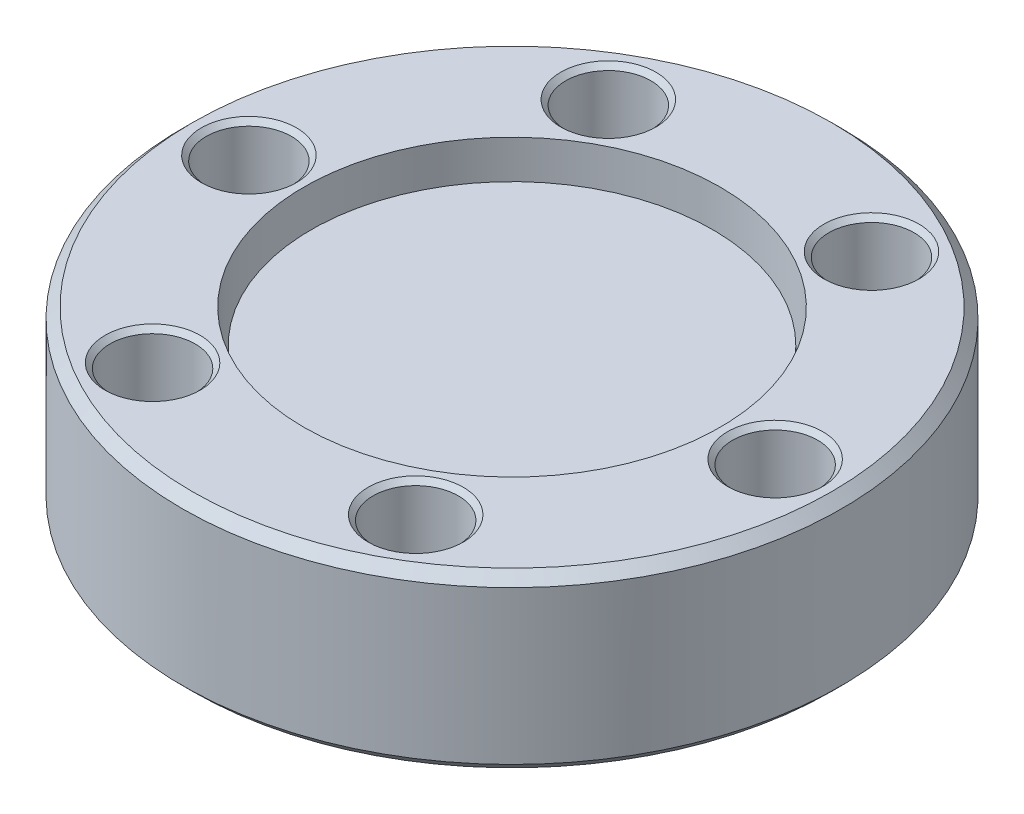
ISO-10303-21;
HEADER;
FILE_DESCRIPTION(('STEP AP214'),'2;1');
FILE_NAME('part.step','',(''),(''),'','','');
FILE_SCHEMA(('AUTOMOTIVE_DESIGN { 1 0 10303 214 1 1 1 1 }'));
ENDSEC;
DATA;
#1=APPLICATION_CONTEXT('core data for automotive mechanical design processes');
#2=APPLICATION_PROTOCOL_DEFINITION('international standard','automotive_design',2000,#1);
#3=PRODUCT_CONTEXT('',#1,'mechanical');
#4=PRODUCT('Part','Part','',(#3));
#5=PRODUCT_RELATED_PRODUCT_CATEGORY('part','',(#4));
#6=PRODUCT_DEFINITION_FORMATION('','',#4);
#7=PRODUCT_DEFINITION_CONTEXT('part definition',#1,'design');
#8=PRODUCT_DEFINITION('design','',#6,#7);
#9=PRODUCT_DEFINITION_SHAPE('','',#8);
#10=(LENGTH_UNIT() NAMED_UNIT(*) SI_UNIT(.MILLI.,.METRE.));
#11=(NAMED_UNIT(*) PLANE_ANGLE_UNIT() SI_UNIT($,.RADIAN.));
#12=(NAMED_UNIT(*) SI_UNIT($,.STERADIAN.) SOLID_ANGLE_UNIT());
#13=UNCERTAINTY_MEASURE_WITH_UNIT(LENGTH_MEASURE(1.E-05),#10,'distance_accuracy_value','');
#14=(GEOMETRIC_REPRESENTATION_CONTEXT(3) GLOBAL_UNCERTAINTY_ASSIGNED_CONTEXT((#13)) GLOBAL_UNIT_ASSIGNED_CONTEXT((#10,
#11,#12)) REPRESENTATION_CONTEXT('',''));
#15=CARTESIAN_POINT('',(0.,0.,0.));
#16=DIRECTION('',(0.,0.,1.));
#17=DIRECTION('',(1.,0.,0.));
#18=AXIS2_PLACEMENT_3D('',#15,#16,#17);
#19=CARTESIAN_POINT('',(0.,0.,0.));
#20=DIRECTION('',(0.,1.,0.));
#21=DIRECTION('',(0.,0.,1.));
#22=AXIS2_PLACEMENT_3D('',#19,#20,#21);
#23=CONICAL_SURFACE('',#22,16.383,0.785398163397452);
#24=CARTESIAN_POINT('',(0.,0.,0.));
#25=DIRECTION('',(0.,-1.,0.));
#26=DIRECTION('',(0.,0.,-1.));
#27=AXIS2_PLACEMENT_3D('',#24,#25,#26);
#28=CIRCLE('',#27,16.383);
#29=CARTESIAN_POINT('',(0.,0.,-16.383));
#30=VERTEX_POINT('',#29);
#31=EDGE_CURVE('E287',#30,#30,#28,.T.);
#32=ORIENTED_EDGE('',*,*,#31,.F.);
#33=EDGE_LOOP('',(#32));
#34=FACE_BOUND('',#33,.T.);
#35=CARTESIAN_POINT('',(0.,0.508,0.));
#36=DIRECTION('',(0.,1.,0.));
#37=DIRECTION('',(0.,0.,-1.));
#38=AXIS2_PLACEMENT_3D('',#35,#36,#37);
#39=CIRCLE('',#38,16.891);
#40=CARTESIAN_POINT('',(0.,0.508,-16.891));
#41=VERTEX_POINT('',#40);
#42=EDGE_CURVE('E277',#41,#41,#39,.T.);
#43=ORIENTED_EDGE('',*,*,#42,.F.);
#44=EDGE_LOOP('',(#43));
#45=FACE_BOUND('',#44,.T.);
#46=ADVANCED_FACE('F16',(#34,#45),#23,.T.);
#47=CARTESIAN_POINT('',(0.,8.3566,0.));
#48=DIRECTION('',(0.,-1.,0.));
#49=DIRECTION('',(0.,0.,-1.));
#50=AXIS2_PLACEMENT_3D('',#47,#48,#49);
#51=CONICAL_SURFACE('',#50,16.891,0.785398163397452);
#52=CARTESIAN_POINT('',(0.,8.8646,0.));
#53=DIRECTION('',(0.,1.,0.));
#54=DIRECTION('',(0.,0.,1.));
#55=AXIS2_PLACEMENT_3D('',#52,#53,#54);
#56=CIRCLE('',#55,16.383);
#57=CARTESIAN_POINT('',(0.,8.8646,16.383));
#58=VERTEX_POINT('',#57);
#59=EDGE_CURVE('E335',#58,#58,#56,.T.);
#60=ORIENTED_EDGE('',*,*,#59,.F.);
#61=EDGE_LOOP('',(#60));
#62=FACE_BOUND('',#61,.T.);
#63=CARTESIAN_POINT('',(0.,8.3566,0.));
#64=DIRECTION('',(0.,-1.,0.));
#65=DIRECTION('',(0.,0.,1.));
#66=AXIS2_PLACEMENT_3D('',#63,#64,#65);
#67=CIRCLE('',#66,16.891);
#68=CARTESIAN_POINT('',(0.,8.3566,16.891));
#69=VERTEX_POINT('',#68);
#70=EDGE_CURVE('E273',#69,#69,#67,.T.);
#71=ORIENTED_EDGE('',*,*,#70,.F.);
#72=EDGE_LOOP('',(#71));
#73=FACE_BOUND('',#72,.T.);
#74=ADVANCED_FACE('F431',(#62,#73),#51,.T.);
#75=CARTESIAN_POINT('',(6.74370000000013,8.6106,11.6804310310022));
#76=DIRECTION('',(0.,1.,0.));
#77=DIRECTION('',(0.,0.,1.));
#78=AXIS2_PLACEMENT_3D('',#75,#76,#77);
#79=CONICAL_SURFACE('',#78,2.1844,0.785398163397448);
#80=CARTESIAN_POINT('',(6.74370000000013,8.6106,11.6804310310022));
#81=DIRECTION('',(0.,1.,0.));
#82=DIRECTION('',(0.,0.,1.));
#83=AXIS2_PLACEMENT_3D('',#80,#81,#82);
#84=CIRCLE('',#83,2.1844);
#85=CARTESIAN_POINT('',(6.74370000000013,8.6106,13.8648310310022));
#86=VERTEX_POINT('',#85);
#87=EDGE_CURVE('E19',#86,#86,#84,.T.);
#88=ORIENTED_EDGE('',*,*,#87,.F.);
#89=EDGE_LOOP('',(#88));
#90=FACE_BOUND('',#89,.T.);
#91=CARTESIAN_POINT('',(6.74370000000013,8.8646,11.6804310310022));
#92=DIRECTION('',(0.,-1.,0.));
#93=DIRECTION('',(0.,0.,1.));
#94=AXIS2_PLACEMENT_3D('',#91,#92,#93);
#95=CIRCLE('',#94,2.4384);
#96=CARTESIAN_POINT('',(6.74370000000013,8.8646,14.1188310310021));
#97=VERTEX_POINT('',#96);
#98=EDGE_CURVE('E332',#97,#97,#95,.T.);
#99=ORIENTED_EDGE('',*,*,#98,.F.);
#100=EDGE_LOOP('',(#99));
#101=FACE_BOUND('',#100,.T.);
#102=ADVANCED_FACE('F436',(#90,#101),#79,.F.);
#103=CARTESIAN_POINT('',(6.74370000000013,0.,11.6804310310022));
#104=DIRECTION('',(0.,-1.,0.));
#105=DIRECTION('',(0.,0.,-1.));
#106=AXIS2_PLACEMENT_3D('',#103,#104,#105);
#107=CONICAL_SURFACE('',#106,2.4384,0.785398163397448);
#108=CARTESIAN_POINT('',(6.74370000000013,0.25399999999998,11.6804310310022));
#109=DIRECTION('',(0.,-1.,0.));
#110=DIRECTION('',(0.,0.,-1.));
#111=AXIS2_PLACEMENT_3D('',#108,#109,#110);
#112=CIRCLE('',#111,2.1844);
#113=CARTESIAN_POINT('',(6.74370000000013,0.25399999999998,9.49603103100216));
#114=VERTEX_POINT('',#113);
#115=EDGE_CURVE('E10',#114,#114,#112,.T.);
#116=ORIENTED_EDGE('',*,*,#115,.F.);
#117=EDGE_LOOP('',(#116));
#118=FACE_BOUND('',#117,.T.);
#119=CARTESIAN_POINT('',(6.74370000000013,0.,11.6804310310022));
#120=DIRECTION('',(0.,1.,0.));
#121=DIRECTION('',(0.,0.,-1.));
#122=AXIS2_PLACEMENT_3D('',#119,#120,#121);
#123=CIRCLE('',#122,2.4384);
#124=CARTESIAN_POINT('',(6.74370000000013,0.,9.24203103100219));
#125=VERTEX_POINT('',#124);
#126=EDGE_CURVE('E284',#125,#125,#123,.T.);
#127=ORIENTED_EDGE('',*,*,#126,.F.);
#128=EDGE_LOOP('',(#127));
#129=FACE_BOUND('',#128,.T.);
#130=ADVANCED_FACE('F854',(#118,#129),#107,.F.);
#131=CARTESIAN_POINT('',(-6.7436999999999,8.6106,11.6804310310023));
#132=DIRECTION('',(0.,1.,0.));
#133=DIRECTION('',(0.,0.,1.));
#134=AXIS2_PLACEMENT_3D('',#131,#132,#133);
#135=CONICAL_SURFACE('',#134,2.1844,0.785398163397457);
#136=CARTESIAN_POINT('',(-6.7436999999999,8.6106,11.6804310310023));
#137=DIRECTION('',(0.,1.,0.));
#138=DIRECTION('',(0.,0.,1.));
#139=AXIS2_PLACEMENT_3D('',#136,#137,#138);
#140=CIRCLE('',#139,2.1844);
#141=CARTESIAN_POINT('',(-6.7436999999999,8.6106,13.8648310310023));
#142=VERTEX_POINT('',#141);
#143=EDGE_CURVE('E258',#142,#142,#140,.T.);
#144=ORIENTED_EDGE('',*,*,#143,.F.);
#145=EDGE_LOOP('',(#144));
#146=FACE_BOUND('',#145,.T.);
#147=CARTESIAN_POINT('',(-6.7436999999999,8.8646,11.6804310310023));
#148=DIRECTION('',(0.,-1.,0.));
#149=DIRECTION('',(0.,0.,1.));
#150=AXIS2_PLACEMENT_3D('',#147,#148,#149);
#151=CIRCLE('',#150,2.4384);
#152=CARTESIAN_POINT('',(-6.7436999999999,8.8646,14.1188310310023));
#153=VERTEX_POINT('',#152);
#154=EDGE_CURVE('E329',#153,#153,#151,.T.);
#155=ORIENTED_EDGE('',*,*,#154,.F.);
#156=EDGE_LOOP('',(#155));
#157=FACE_BOUND('',#156,.T.);
#158=ADVANCED_FACE('F845',(#146,#157),#135,.F.);
#159=CARTESIAN_POINT('',(-6.7436999999999,0.,11.6804310310023));
#160=DIRECTION('',(0.,-1.,0.));
#161=DIRECTION('',(0.,0.,-1.));
#162=AXIS2_PLACEMENT_3D('',#159,#160,#161);
#163=CONICAL_SURFACE('',#162,2.4384,0.785398163397456);
#164=CARTESIAN_POINT('',(-6.7436999999999,0.253999999999994,11.6804310310023));
#165=DIRECTION('',(0.,-1.,0.));
#166=DIRECTION('',(0.,0.,-1.));
#167=AXIS2_PLACEMENT_3D('',#164,#165,#166);
#168=CIRCLE('',#167,2.1844);
#169=CARTESIAN_POINT('',(-6.7436999999999,0.253999999999994,9.49603103100229));
#170=VERTEX_POINT('',#169);
#171=EDGE_CURVE('E261',#170,#170,#168,.T.);
#172=ORIENTED_EDGE('',*,*,#171,.F.);
#173=EDGE_LOOP('',(#172));
#174=FACE_BOUND('',#173,.T.);
#175=CARTESIAN_POINT('',(-6.7436999999999,0.,11.6804310310023));
#176=DIRECTION('',(0.,1.,0.));
#177=DIRECTION('',(0.,0.,-1.));
#178=AXIS2_PLACEMENT_3D('',#175,#176,#177);
#179=CIRCLE('',#178,2.4384);
#180=CARTESIAN_POINT('',(-6.7436999999999,0.,9.24203103100229));
#181=VERTEX_POINT('',#180);
#182=EDGE_CURVE('E249',#181,#181,#179,.T.);
#183=ORIENTED_EDGE('',*,*,#182,.F.);
#184=EDGE_LOOP('',(#183));
#185=FACE_BOUND('',#184,.T.);
#186=ADVANCED_FACE('F836',(#174,#185),#163,.F.);
#187=CARTESIAN_POINT('',(-13.4874,8.6106,0.));
#188=DIRECTION('',(0.,1.,0.));
#189=DIRECTION('',(0.,0.,1.));
#190=AXIS2_PLACEMENT_3D('',#187,#188,#189);
#191=CONICAL_SURFACE('',#190,2.1844,0.785398163397447);
#192=CARTESIAN_POINT('',(-13.4874,8.6106,0.));
#193=DIRECTION('',(0.,1.,0.));
#194=DIRECTION('',(0.,0.,1.));
#195=AXIS2_PLACEMENT_3D('',#192,#193,#194);
#196=CIRCLE('',#195,2.1844);
#197=CARTESIAN_POINT('',(-13.4874,8.6106,2.1844000000001));
#198=VERTEX_POINT('',#197);
#199=EDGE_CURVE('E361',#198,#198,#196,.T.);
#200=ORIENTED_EDGE('',*,*,#199,.F.);
#201=EDGE_LOOP('',(#200));
#202=FACE_BOUND('',#201,.T.);
#203=CARTESIAN_POINT('',(-13.4874,8.8646,0.));
#204=DIRECTION('',(0.,-1.,0.));
#205=DIRECTION('',(0.,0.,1.));
#206=AXIS2_PLACEMENT_3D('',#203,#204,#205);
#207=CIRCLE('',#206,2.4384);
#208=CARTESIAN_POINT('',(-13.4874,8.8646,2.43840000000009));
#209=VERTEX_POINT('',#208);
#210=EDGE_CURVE('E326',#209,#209,#207,.T.);
#211=ORIENTED_EDGE('',*,*,#210,.F.);
#212=EDGE_LOOP('',(#211));
#213=FACE_BOUND('',#212,.T.);
#214=ADVANCED_FACE('F392',(#202,#213),#191,.F.);
#215=CARTESIAN_POINT('',(-13.4874,0.,0.));
#216=DIRECTION('',(0.,-1.,0.));
#217=DIRECTION('',(0.,0.,-1.));
#218=AXIS2_PLACEMENT_3D('',#215,#216,#217);
#219=CONICAL_SURFACE('',#218,2.4384,0.785398163397436);
#220=CARTESIAN_POINT('',(-13.4874,0.254000000000007,0.));
#221=DIRECTION('',(0.,-1.,0.));
#222=DIRECTION('',(0.,0.,-1.));
#223=AXIS2_PLACEMENT_3D('',#220,#221,#222);
#224=CIRCLE('',#223,2.1844);
#225=CARTESIAN_POINT('',(-13.4874,0.254000000000007,-2.18439999999991));
#226=VERTEX_POINT('',#225);
#227=EDGE_CURVE('E262',#226,#226,#224,.T.);
#228=ORIENTED_EDGE('',*,*,#227,.F.);
#229=EDGE_LOOP('',(#228));
#230=FACE_BOUND('',#229,.T.);
#231=CARTESIAN_POINT('',(-13.4874,0.,0.));
#232=DIRECTION('',(0.,1.,0.));
#233=DIRECTION('',(0.,0.,-1.));
#234=AXIS2_PLACEMENT_3D('',#231,#232,#233);
#235=CIRCLE('',#234,2.4384);
#236=CARTESIAN_POINT('',(-13.4874,0.,-2.43839999999991));
#237=VERTEX_POINT('',#236);
#238=EDGE_CURVE('E272',#237,#237,#235,.T.);
#239=ORIENTED_EDGE('',*,*,#238,.F.);
#240=EDGE_LOOP('',(#239));
#241=FACE_BOUND('',#240,.T.);
#242=ADVANCED_FACE('F388',(#230,#241),#219,.F.);
#243=CARTESIAN_POINT('',(-6.7437,8.6106,-11.6804310310022));
#244=DIRECTION('',(0.,1.,0.));
#245=DIRECTION('',(0.,0.,1.));
#246=AXIS2_PLACEMENT_3D('',#243,#244,#245);
#247=CONICAL_SURFACE('',#246,2.1844,0.785398163397465);
#248=CARTESIAN_POINT('',(-6.7437,8.6106,-11.6804310310022));
#249=DIRECTION('',(0.,1.,0.));
#250=DIRECTION('',(0.,0.,1.));
#251=AXIS2_PLACEMENT_3D('',#248,#249,#250);
#252=CIRCLE('',#251,2.1844);
#253=CARTESIAN_POINT('',(-6.7437,8.6106,-9.49603103100221));
#254=VERTEX_POINT('',#253);
#255=EDGE_CURVE('E362',#254,#254,#252,.T.);
#256=ORIENTED_EDGE('',*,*,#255,.F.);
#257=EDGE_LOOP('',(#256));
#258=FACE_BOUND('',#257,.T.);
#259=CARTESIAN_POINT('',(-6.7437,8.8646,-11.6804310310022));
#260=DIRECTION('',(0.,-1.,0.));
#261=DIRECTION('',(0.,0.,1.));
#262=AXIS2_PLACEMENT_3D('',#259,#260,#261);
#263=CIRCLE('',#262,2.4384);
#264=CARTESIAN_POINT('',(-6.7437,8.8646,-9.24203103100219));
#265=VERTEX_POINT('',#264);
#266=EDGE_CURVE('E323',#265,#265,#263,.T.);
#267=ORIENTED_EDGE('',*,*,#266,.F.);
#268=EDGE_LOOP('',(#267));
#269=FACE_BOUND('',#268,.T.);
#270=ADVANCED_FACE('F391',(#258,#269),#247,.F.);
#271=CARTESIAN_POINT('',(-6.7437,0.,-11.6804310310022));
#272=DIRECTION('',(0.,-1.,0.));
#273=DIRECTION('',(0.,0.,-1.));
#274=AXIS2_PLACEMENT_3D('',#271,#272,#273);
#275=CONICAL_SURFACE('',#274,2.4384,0.785398163397442);
#276=CARTESIAN_POINT('',(-6.7437,0.253999999999994,-11.6804310310022));
#277=DIRECTION('',(0.,-1.,0.));
#278=DIRECTION('',(0.,0.,-1.));
#279=AXIS2_PLACEMENT_3D('',#276,#277,#278);
#280=CIRCLE('',#279,2.1844);
#281=CARTESIAN_POINT('',(-6.7437,0.253999999999994,-13.8648310310022));
#282=VERTEX_POINT('',#281);
#283=EDGE_CURVE('E358',#282,#282,#280,.T.);
#284=ORIENTED_EDGE('',*,*,#283,.F.);
#285=EDGE_LOOP('',(#284));
#286=FACE_BOUND('',#285,.T.);
#287=CARTESIAN_POINT('',(-6.7437,0.,-11.6804310310022));
#288=DIRECTION('',(0.,1.,0.));
#289=DIRECTION('',(0.,0.,-1.));
#290=AXIS2_PLACEMENT_3D('',#287,#288,#289);
#291=CIRCLE('',#290,2.4384);
#292=CARTESIAN_POINT('',(-6.7437,0.,-14.1188310310022));
#293=VERTEX_POINT('',#292);
#294=EDGE_CURVE('E252',#293,#293,#291,.T.);
#295=ORIENTED_EDGE('',*,*,#294,.F.);
#296=EDGE_LOOP('',(#295));
#297=FACE_BOUND('',#296,.T.);
#298=ADVANCED_FACE('F811',(#286,#297),#275,.F.);
#299=CARTESIAN_POINT('',(6.7437,8.6106,-11.6804310310023));
#300=DIRECTION('',(0.,1.,0.));
#301=DIRECTION('',(0.,0.,1.));
#302=AXIS2_PLACEMENT_3D('',#299,#300,#301);
#303=CONICAL_SURFACE('',#302,2.1844,0.785398163397454);
#304=CARTESIAN_POINT('',(6.7437,8.6106,-11.6804310310023));
#305=DIRECTION('',(0.,1.,0.));
#306=DIRECTION('',(0.,0.,1.));
#307=AXIS2_PLACEMENT_3D('',#304,#305,#306);
#308=CIRCLE('',#307,2.1844);
#309=CARTESIAN_POINT('',(6.7437,8.6106,-9.49603103100227));
#310=VERTEX_POINT('',#309);
#311=EDGE_CURVE('E371',#310,#310,#308,.T.);
#312=ORIENTED_EDGE('',*,*,#311,.F.);
#313=EDGE_LOOP('',(#312));
#314=FACE_BOUND('',#313,.T.);
#315=CARTESIAN_POINT('',(6.7437,8.8646,-11.6804310310023));
#316=DIRECTION('',(0.,-1.,0.));
#317=DIRECTION('',(0.,0.,1.));
#318=AXIS2_PLACEMENT_3D('',#315,#316,#317);
#319=CIRCLE('',#318,2.4384);
#320=CARTESIAN_POINT('',(6.7437,8.8646,-9.24203103100224));
#321=VERTEX_POINT('',#320);
#322=EDGE_CURVE('E320',#321,#321,#319,.T.);
#323=ORIENTED_EDGE('',*,*,#322,.F.);
#324=EDGE_LOOP('',(#323));
#325=FACE_BOUND('',#324,.T.);
#326=ADVANCED_FACE('F795',(#314,#325),#303,.F.);
#327=CARTESIAN_POINT('',(6.7437,0.,-11.6804310310023));
#328=DIRECTION('',(0.,-1.,0.));
#329=DIRECTION('',(0.,0.,-1.));
#330=AXIS2_PLACEMENT_3D('',#327,#328,#329);
#331=CONICAL_SURFACE('',#330,2.4384,0.785398163397457);
#332=CARTESIAN_POINT('',(6.7437,0.253999999999988,-11.6804310310023));
#333=DIRECTION('',(0.,-1.,0.));
#334=DIRECTION('',(0.,0.,-1.));
#335=AXIS2_PLACEMENT_3D('',#332,#333,#334);
#336=CIRCLE('',#335,2.1844);
#337=CARTESIAN_POINT('',(6.7437,0.253999999999988,-13.8648310310023));
#338=VERTEX_POINT('',#337);
#339=EDGE_CURVE('E374',#338,#338,#336,.T.);
#340=ORIENTED_EDGE('',*,*,#339,.F.);
#341=EDGE_LOOP('',(#340));
#342=FACE_BOUND('',#341,.T.);
#343=CARTESIAN_POINT('',(6.7437,0.,-11.6804310310023));
#344=DIRECTION('',(0.,1.,0.));
#345=DIRECTION('',(0.,0.,-1.));
#346=AXIS2_PLACEMENT_3D('',#343,#344,#345);
#347=CIRCLE('',#346,2.4384);
#348=CARTESIAN_POINT('',(6.7437,0.,-14.1188310310022));
#349=VERTEX_POINT('',#348);
#350=EDGE_CURVE('E250',#349,#349,#347,.T.);
#351=ORIENTED_EDGE('',*,*,#350,.F.);
#352=EDGE_LOOP('',(#351));
#353=FACE_BOUND('',#352,.T.);
#354=ADVANCED_FACE('F791',(#342,#353),#331,.F.);
#355=CARTESIAN_POINT('',(6.74370000000013,0.,11.6804310310022));
#356=DIRECTION('',(0.,1.,0.));
#357=DIRECTION('',(0.,0.,1.));
#358=AXIS2_PLACEMENT_3D('',#355,#356,#357);
#359=CYLINDRICAL_SURFACE('',#358,2.1844);
#360=ORIENTED_EDGE('',*,*,#115,.T.);
#361=EDGE_LOOP('',(#360));
#362=FACE_BOUND('',#361,.T.);
#363=ORIENTED_EDGE('',*,*,#87,.T.);
#364=EDGE_LOOP('',(#363));
#365=FACE_BOUND('',#364,.T.);
#366=ADVANCED_FACE('F785',(#362,#365),#359,.F.);
#367=CARTESIAN_POINT('',(-6.7436999999999,0.,11.6804310310023));
#368=DIRECTION('',(0.,1.,0.));
#369=DIRECTION('',(0.,0.,1.));
#370=AXIS2_PLACEMENT_3D('',#367,#368,#369);
#371=CYLINDRICAL_SURFACE('',#370,2.1844);
#372=ORIENTED_EDGE('',*,*,#171,.T.);
#373=EDGE_LOOP('',(#372));
#374=FACE_BOUND('',#373,.T.);
#375=ORIENTED_EDGE('',*,*,#143,.T.);
#376=EDGE_LOOP('',(#375));
#377=FACE_BOUND('',#376,.T.);
#378=ADVANCED_FACE('F777',(#374,#377),#371,.F.);
#379=CARTESIAN_POINT('',(-13.4874,0.,0.));
#380=DIRECTION('',(0.,1.,0.));
#381=DIRECTION('',(0.,0.,1.));
#382=AXIS2_PLACEMENT_3D('',#379,#380,#381);
#383=CYLINDRICAL_SURFACE('',#382,2.1844);
#384=ORIENTED_EDGE('',*,*,#227,.T.);
#385=EDGE_LOOP('',(#384));
#386=FACE_BOUND('',#385,.T.);
#387=ORIENTED_EDGE('',*,*,#199,.T.);
#388=EDGE_LOOP('',(#387));
#389=FACE_BOUND('',#388,.T.);
#390=ADVANCED_FACE('F385',(#386,#389),#383,.F.);
#391=CARTESIAN_POINT('',(-6.7437,0.,-11.6804310310022));
#392=DIRECTION('',(0.,1.,0.));
#393=DIRECTION('',(0.,0.,1.));
#394=AXIS2_PLACEMENT_3D('',#391,#392,#393);
#395=CYLINDRICAL_SURFACE('',#394,2.1844);
#396=ORIENTED_EDGE('',*,*,#283,.T.);
#397=EDGE_LOOP('',(#396));
#398=FACE_BOUND('',#397,.T.);
#399=ORIENTED_EDGE('',*,*,#255,.T.);
#400=EDGE_LOOP('',(#399));
#401=FACE_BOUND('',#400,.T.);
#402=ADVANCED_FACE('F761',(#398,#401),#395,.F.);
#403=CARTESIAN_POINT('',(6.7437,0.,-11.6804310310023));
#404=DIRECTION('',(0.,1.,0.));
#405=DIRECTION('',(0.,0.,1.));
#406=AXIS2_PLACEMENT_3D('',#403,#404,#405);
#407=CYLINDRICAL_SURFACE('',#406,2.1844);
#408=ORIENTED_EDGE('',*,*,#339,.T.);
#409=EDGE_LOOP('',(#408));
#410=FACE_BOUND('',#409,.T.);
#411=ORIENTED_EDGE('',*,*,#311,.T.);
#412=EDGE_LOOP('',(#411));
#413=FACE_BOUND('',#412,.T.);
#414=ADVANCED_FACE('F517',(#410,#413),#407,.F.);
#415=CARTESIAN_POINT('',(13.4874,8.6106,0.));
#416=DIRECTION('',(0.,1.,0.));
#417=DIRECTION('',(0.,0.,1.));
#418=AXIS2_PLACEMENT_3D('',#415,#416,#417);
#419=CONICAL_SURFACE('',#418,2.1844,0.785398163397447);
#420=CARTESIAN_POINT('',(13.4874,8.6106,0.));
#421=DIRECTION('',(0.,1.,0.));
#422=DIRECTION('',(0.,0.,1.));
#423=AXIS2_PLACEMENT_3D('',#420,#421,#422);
#424=CIRCLE('',#423,2.1844);
#425=CARTESIAN_POINT('',(13.4874,8.6106,2.1844));
#426=VERTEX_POINT('',#425);
#427=EDGE_CURVE('E365',#426,#426,#424,.T.);
#428=ORIENTED_EDGE('',*,*,#427,.F.);
#429=EDGE_LOOP('',(#428));
#430=FACE_BOUND('',#429,.T.);
#431=CARTESIAN_POINT('',(13.4874,8.8646,0.));
#432=DIRECTION('',(0.,-1.,0.));
#433=DIRECTION('',(0.,0.,1.));
#434=AXIS2_PLACEMENT_3D('',#431,#432,#433);
#435=CIRCLE('',#434,2.4384);
#436=CARTESIAN_POINT('',(13.4874,8.8646,2.4384));
#437=VERTEX_POINT('',#436);
#438=EDGE_CURVE('E317',#437,#437,#435,.T.);
#439=ORIENTED_EDGE('',*,*,#438,.F.);
#440=EDGE_LOOP('',(#439));
#441=FACE_BOUND('',#440,.T.);
#442=ADVANCED_FACE('F514',(#430,#441),#419,.F.);
#443=CARTESIAN_POINT('',(13.4874,0.,0.));
#444=DIRECTION('',(0.,-1.,0.));
#445=DIRECTION('',(0.,0.,-1.));
#446=AXIS2_PLACEMENT_3D('',#443,#444,#445);
#447=CONICAL_SURFACE('',#446,2.4384,0.785398163397436);
#448=CARTESIAN_POINT('',(13.4874,0.254000000000007,0.));
#449=DIRECTION('',(0.,-1.,0.));
#450=DIRECTION('',(0.,0.,-1.));
#451=AXIS2_PLACEMENT_3D('',#448,#449,#450);
#452=CIRCLE('',#451,2.1844);
#453=CARTESIAN_POINT('',(13.4874,0.254000000000007,-2.1844));
#454=VERTEX_POINT('',#453);
#455=EDGE_CURVE('E368',#454,#454,#452,.T.);
#456=ORIENTED_EDGE('',*,*,#455,.F.);
#457=EDGE_LOOP('',(#456));
#458=FACE_BOUND('',#457,.T.);
#459=CARTESIAN_POINT('',(13.4874,0.,0.));
#460=DIRECTION('',(0.,1.,0.));
#461=DIRECTION('',(0.,0.,-1.));
#462=AXIS2_PLACEMENT_3D('',#459,#460,#461);
#463=CIRCLE('',#462,2.4384);
#464=CARTESIAN_POINT('',(13.4874,0.,-2.4384));
#465=VERTEX_POINT('',#464);
#466=EDGE_CURVE('E245',#465,#465,#463,.T.);
#467=ORIENTED_EDGE('',*,*,#466,.F.);
#468=EDGE_LOOP('',(#467));
#469=FACE_BOUND('',#468,.T.);
#470=ADVANCED_FACE('F425',(#458,#469),#447,.F.);
#471=CARTESIAN_POINT('',(13.4874,0.,0.));
#472=DIRECTION('',(0.,1.,0.));
#473=DIRECTION('',(0.,0.,1.));
#474=AXIS2_PLACEMENT_3D('',#471,#472,#473);
#475=CYLINDRICAL_SURFACE('',#474,2.1844);
#476=ORIENTED_EDGE('',*,*,#455,.T.);
#477=EDGE_LOOP('',(#476));
#478=FACE_BOUND('',#477,.T.);
#479=ORIENTED_EDGE('',*,*,#427,.T.);
#480=EDGE_LOOP('',(#479));
#481=FACE_BOUND('',#480,.T.);
#482=ADVANCED_FACE('F414',(#478,#481),#475,.F.);
#483=CARTESIAN_POINT('',(0.,0.,0.));
#484=DIRECTION('',(0.,-1.,0.));
#485=DIRECTION('',(0.,0.,-1.));
#486=AXIS2_PLACEMENT_3D('',#483,#484,#485);
#487=CYLINDRICAL_SURFACE('',#486,10.7188);
#488=CARTESIAN_POINT('',(0.,1.20818032492242,0.));
#489=DIRECTION('',(0.,-1.,0.));
#490=DIRECTION('',(0.,0.,-1.));
#491=AXIS2_PLACEMENT_3D('',#488,#489,#490);
#492=CIRCLE('',#491,10.7188);
#493=CARTESIAN_POINT('',(0.,1.20818032492242,-10.7188));
#494=VERTEX_POINT('',#493);
#495=EDGE_CURVE('E295',#494,#494,#492,.T.);
#496=ORIENTED_EDGE('',*,*,#495,.F.);
#497=EDGE_LOOP('',(#496));
#498=FACE_BOUND('',#497,.T.);
#499=CARTESIAN_POINT('',(0.,0.,0.));
#500=DIRECTION('',(0.,-1.,0.));
#501=DIRECTION('',(0.,0.,-1.));
#502=AXIS2_PLACEMENT_3D('',#499,#500,#501);
#503=CIRCLE('',#502,10.7188);
#504=CARTESIAN_POINT('',(0.,0.,-10.7188));
#505=VERTEX_POINT('',#504);
#506=EDGE_CURVE('E239',#505,#505,#503,.T.);
#507=ORIENTED_EDGE('',*,*,#506,.T.);
#508=EDGE_LOOP('',(#507));
#509=FACE_BOUND('',#508,.T.);
#510=ADVANCED_FACE('F411',(#498,#509),#487,.F.);
#511=CARTESIAN_POINT('',(0.,0.635,0.));
#512=DIRECTION('',(0.,1.,0.));
#513=DIRECTION('',(0.,0.,1.));
#514=AXIS2_PLACEMENT_3D('',#511,#512,#513);
#515=CONICAL_SURFACE('',#514,9.144,1.22173047639603);
#516=CARTESIAN_POINT('',(0.,0.635,0.));
#517=DIRECTION('',(0.,-1.,0.));
#518=DIRECTION('',(0.,0.,-1.));
#519=AXIS2_PLACEMENT_3D('',#516,#517,#518);
#520=CIRCLE('',#519,9.144);
#521=CARTESIAN_POINT('',(0.,0.635,-9.144));
#522=VERTEX_POINT('',#521);
#523=EDGE_CURVE('E292',#522,#522,#520,.T.);
#524=ORIENTED_EDGE('',*,*,#523,.F.);
#525=EDGE_LOOP('',(#524));
#526=FACE_BOUND('',#525,.T.);
#527=ORIENTED_EDGE('',*,*,#495,.T.);
#528=EDGE_LOOP('',(#527));
#529=FACE_BOUND('',#528,.T.);
#530=ADVANCED_FACE('F413',(#526,#529),#515,.T.);
#531=CARTESIAN_POINT('',(0.,0.,0.));
#532=DIRECTION('',(0.,-1.,0.));
#533=DIRECTION('',(0.,0.,-1.));
#534=AXIS2_PLACEMENT_3D('',#531,#532,#533);
#535=CYLINDRICAL_SURFACE('',#534,9.144);
#536=CARTESIAN_POINT('',(0.,1.143,0.));
#537=DIRECTION('',(0.,-1.,0.));
#538=DIRECTION('',(0.,0.,-1.));
#539=AXIS2_PLACEMENT_3D('',#536,#537,#538);
#540=CIRCLE('',#539,9.144);
#541=CARTESIAN_POINT('',(0.,1.143,-9.144));
#542=VERTEX_POINT('',#541);
#543=EDGE_CURVE('E253',#542,#542,#540,.T.);
#544=ORIENTED_EDGE('',*,*,#543,.F.);
#545=EDGE_LOOP('',(#544));
#546=FACE_BOUND('',#545,.T.);
#547=ORIENTED_EDGE('',*,*,#523,.T.);
#548=EDGE_LOOP('',(#547));
#549=FACE_BOUND('',#548,.T.);
#550=ADVANCED_FACE('F422',(#546,#549),#535,.F.);
#551=CARTESIAN_POINT('',(0.,0.,0.));
#552=DIRECTION('',(0.,-1.,0.));
#553=DIRECTION('',(0.,0.,-1.));
#554=AXIS2_PLACEMENT_3D('',#551,#552,#553);
#555=CYLINDRICAL_SURFACE('',#554,8.001);
#556=CARTESIAN_POINT('',(0.,1.651,0.));
#557=DIRECTION('',(0.,-1.,0.));
#558=DIRECTION('',(0.,0.,-1.));
#559=AXIS2_PLACEMENT_3D('',#556,#557,#558);
#560=CIRCLE('',#559,8.001);
#561=CARTESIAN_POINT('',(0.,1.651,-8.001));
#562=VERTEX_POINT('',#561);
#563=EDGE_CURVE('E255',#562,#562,#560,.T.);
#564=ORIENTED_EDGE('',*,*,#563,.F.);
#565=EDGE_LOOP('',(#564));
#566=FACE_BOUND('',#565,.T.);
#567=CARTESIAN_POINT('',(0.,1.143,0.));
#568=DIRECTION('',(0.,-1.,0.));
#569=DIRECTION('',(0.,0.,-1.));
#570=AXIS2_PLACEMENT_3D('',#567,#568,#569);
#571=CIRCLE('',#570,8.001);
#572=CARTESIAN_POINT('',(0.,1.143,-8.001));
#573=VERTEX_POINT('',#572);
#574=EDGE_CURVE('E256',#573,#573,#571,.T.);
#575=ORIENTED_EDGE('',*,*,#574,.T.);
#576=EDGE_LOOP('',(#575));
#577=FACE_BOUND('',#576,.T.);
#578=ADVANCED_FACE('F470',(#566,#577),#555,.F.);
#579=CARTESIAN_POINT('',(0.,0.,0.));
#580=DIRECTION('',(0.,-1.,0.));
#581=DIRECTION('',(0.,0.,-1.));
#582=AXIS2_PLACEMENT_3D('',#579,#580,#581);
#583=CYLINDRICAL_SURFACE('',#582,8.382);
#584=CARTESIAN_POINT('',(0.,2.55438257906458,0.));
#585=DIRECTION('',(0.,-1.,0.));
#586=DIRECTION('',(0.,0.,-1.));
#587=AXIS2_PLACEMENT_3D('',#584,#585,#586);
#588=CIRCLE('',#587,8.382);
#589=CARTESIAN_POINT('',(0.,2.55438257906458,-8.382));
#590=VERTEX_POINT('',#589);
#591=EDGE_CURVE('E296',#590,#590,#588,.T.);
#592=ORIENTED_EDGE('',*,*,#591,.F.);
#593=EDGE_LOOP('',(#592));
#594=FACE_BOUND('',#593,.T.);
#595=CARTESIAN_POINT('',(0.,2.01222733190585,0.));
#596=DIRECTION('',(0.,-1.,0.));
#597=DIRECTION('',(0.,0.,-1.));
#598=AXIS2_PLACEMENT_3D('',#595,#596,#597);
#599=CIRCLE('',#598,8.382);
#600=CARTESIAN_POINT('',(0.,2.01222733190585,-8.382));
#601=VERTEX_POINT('',#600);
#602=EDGE_CURVE('E283',#601,#601,#599,.T.);
#603=ORIENTED_EDGE('',*,*,#602,.T.);
#604=EDGE_LOOP('',(#603));
#605=FACE_BOUND('',#604,.T.);
#606=ADVANCED_FACE('F466',(#594,#605),#583,.F.);
#607=CARTESIAN_POINT('',(0.,2.921,0.));
#608=DIRECTION('',(0.,1.,0.));
#609=DIRECTION('',(0.,0.,1.));
#610=AXIS2_PLACEMENT_3D('',#607,#608,#609);
#611=CONICAL_SURFACE('',#610,9.017,1.0471975511966);
#612=ORIENTED_EDGE('',*,*,#591,.T.);
#613=EDGE_LOOP('',(#612));
#614=FACE_BOUND('',#613,.T.);
#615=CARTESIAN_POINT('',(0.,2.921,0.));
#616=DIRECTION('',(0.,-1.,0.));
#617=DIRECTION('',(0.,0.,-1.));
#618=AXIS2_PLACEMENT_3D('',#615,#616,#617);
#619=CIRCLE('',#618,9.017);
#620=CARTESIAN_POINT('',(0.,2.921,-9.017));
#621=VERTEX_POINT('',#620);
#622=EDGE_CURVE('E276',#621,#621,#619,.T.);
#623=ORIENTED_EDGE('',*,*,#622,.F.);
#624=EDGE_LOOP('',(#623));
#625=FACE_BOUND('',#624,.T.);
#626=ADVANCED_FACE('F462',(#614,#625),#611,.F.);
#627=CARTESIAN_POINT('',(0.,0.,0.));
#628=DIRECTION('',(0.,-1.,0.));
#629=DIRECTION('',(0.,0.,-1.));
#630=AXIS2_PLACEMENT_3D('',#627,#628,#629);
#631=CYLINDRICAL_SURFACE('',#630,9.017);
#632=CARTESIAN_POINT('',(0.,4.064,0.));
#633=DIRECTION('',(0.,-1.,0.));
#634=DIRECTION('',(0.,0.,-1.));
#635=AXIS2_PLACEMENT_3D('',#632,#633,#634);
#636=CIRCLE('',#635,9.017);
#637=CARTESIAN_POINT('',(0.,4.064,-9.017));
#638=VERTEX_POINT('',#637);
#639=EDGE_CURVE('E300',#638,#638,#636,.T.);
#640=ORIENTED_EDGE('',*,*,#639,.F.);
#641=EDGE_LOOP('',(#640));
#642=FACE_BOUND('',#641,.T.);
#643=ORIENTED_EDGE('',*,*,#622,.T.);
#644=EDGE_LOOP('',(#643));
#645=FACE_BOUND('',#644,.T.);
#646=ADVANCED_FACE('F455',(#642,#645),#631,.F.);
#647=CARTESIAN_POINT('',(0.,0.,0.));
#648=DIRECTION('',(0.,-1.,0.));
#649=DIRECTION('',(0.,0.,-1.));
#650=AXIS2_PLACEMENT_3D('',#647,#648,#649);
#651=CYLINDRICAL_SURFACE('',#650,10.668);
#652=CARTESIAN_POINT('',(0.,8.8646,0.));
#653=DIRECTION('',(0.,-1.,0.));
#654=DIRECTION('',(0.,0.,-1.));
#655=AXIS2_PLACEMENT_3D('',#652,#653,#654);
#656=CIRCLE('',#655,10.668);
#657=CARTESIAN_POINT('',(0.,8.8646,-10.668));
#658=VERTEX_POINT('',#657);
#659=EDGE_CURVE('E314',#658,#658,#656,.T.);
#660=ORIENTED_EDGE('',*,*,#659,.F.);
#661=EDGE_LOOP('',(#660));
#662=FACE_BOUND('',#661,.T.);
#663=CARTESIAN_POINT('',(0.,4.064,0.));
#664=DIRECTION('',(0.,-1.,0.));
#665=DIRECTION('',(0.,0.,-1.));
#666=AXIS2_PLACEMENT_3D('',#663,#664,#665);
#667=CIRCLE('',#666,10.668);
#668=CARTESIAN_POINT('',(0.,4.064,-10.668));
#669=VERTEX_POINT('',#668);
#670=EDGE_CURVE('E297',#669,#669,#667,.T.);
#671=ORIENTED_EDGE('',*,*,#670,.T.);
#672=EDGE_LOOP('',(#671));
#673=FACE_BOUND('',#672,.T.);
#674=ADVANCED_FACE('F445',(#662,#673),#651,.F.);
#675=CARTESIAN_POINT('',(0.,0.,0.));
#676=DIRECTION('',(0.,-1.,0.));
#677=DIRECTION('',(0.,0.,-1.));
#678=AXIS2_PLACEMENT_3D('',#675,#676,#677);
#679=CYLINDRICAL_SURFACE('',#678,16.891);
#680=ORIENTED_EDGE('',*,*,#70,.T.);
#681=EDGE_LOOP('',(#680));
#682=FACE_BOUND('',#681,.T.);
#683=ORIENTED_EDGE('',*,*,#42,.T.);
#684=EDGE_LOOP('',(#683));
#685=FACE_BOUND('',#684,.T.);
#686=ADVANCED_FACE('F442',(#682,#685),#679,.T.);
#687=CARTESIAN_POINT('',(0.,4.445,0.));
#688=DIRECTION('',(0.,-1.,0.));
#689=DIRECTION('',(-0.00514055764111362,0.,-0.999986787246281));
#690=AXIS2_PLACEMENT_3D('',#687,#688,#689);
#691=TOROIDAL_SURFACE('',#690,10.033,0.254);
#692=CARTESIAN_POINT('',(0.,4.445,0.));
#693=DIRECTION('',(0.,1.,0.));
#694=DIRECTION('',(-0.00514055764111273,0.,-0.999986787246281));
#695=AXIS2_PLACEMENT_3D('',#692,#693,#694);
#696=CIRCLE('',#695,10.287);
#697=CARTESIAN_POINT('',(-0.0528809164541268,4.445,-10.2868640804025));
#698=VERTEX_POINT('',#697);
#699=EDGE_CURVE('E304',#698,#698,#696,.T.);
#700=ORIENTED_EDGE('',*,*,#699,.F.);
#701=EDGE_LOOP('',(#700));
#702=FACE_BOUND('',#701,.T.);
#703=CARTESIAN_POINT('',(0.,4.191,0.));
#704=DIRECTION('',(0.,-1.,0.));
#705=DIRECTION('',(-0.00514055764111362,0.,-0.999986787246281));
#706=AXIS2_PLACEMENT_3D('',#703,#704,#705);
#707=CIRCLE('',#706,10.033);
#708=CARTESIAN_POINT('',(-0.051575214813293,4.191,-10.0328674364419));
#709=VERTEX_POINT('',#708);
#710=EDGE_CURVE('E263',#709,#709,#707,.T.);
#711=ORIENTED_EDGE('',*,*,#710,.F.);
#712=EDGE_LOOP('',(#711));
#713=FACE_BOUND('',#712,.T.);
#714=ADVANCED_FACE('F444',(#702,#713),#691,.T.);
#715=CARTESIAN_POINT('',(0.,4.4958,0.));
#716=DIRECTION('',(0.,1.,0.));
#717=DIRECTION('',(0.00514055764111362,0.,0.999986787246281));
#718=AXIS2_PLACEMENT_3D('',#715,#716,#717);
#719=CONICAL_SURFACE('',#718,8.3947,0.785398163397445);
#720=CARTESIAN_POINT('',(0.,4.1148,0.));
#721=DIRECTION('',(0.,1.,0.));
#722=DIRECTION('',(0.00514055764111362,0.,0.999986787246281));
#723=AXIS2_PLACEMENT_3D('',#720,#721,#722);
#724=CIRCLE('',#723,8.0137);
#725=CARTESIAN_POINT('',(0.0411948867685923,4.1148,8.01359411695553));
#726=VERTEX_POINT('',#725);
#727=EDGE_CURVE('E307',#726,#726,#724,.T.);
#728=ORIENTED_EDGE('',*,*,#727,.F.);
#729=EDGE_LOOP('',(#728));
#730=FACE_BOUND('',#729,.T.);
#731=CARTESIAN_POINT('',(0.,4.4958,0.));
#732=DIRECTION('',(0.,-1.,0.));
#733=DIRECTION('',(0.00514055764111362,0.,0.999986787246281));
#734=AXIS2_PLACEMENT_3D('',#731,#732,#733);
#735=CIRCLE('',#734,8.3947);
#736=CARTESIAN_POINT('',(0.0431534392298564,4.4958,8.39458908289636));
#737=VERTEX_POINT('',#736);
#738=EDGE_CURVE('E340',#737,#737,#735,.T.);
#739=ORIENTED_EDGE('',*,*,#738,.F.);
#740=EDGE_LOOP('',(#739));
#741=FACE_BOUND('',#740,.T.);
#742=ADVANCED_FACE('F452',(#730,#741),#719,.F.);
#743=CARTESIAN_POINT('',(0.,1.651,0.));
#744=DIRECTION('',(0.,-1.,0.));
#745=DIRECTION('',(-0.00514055764111362,0.,-0.999986787246281));
#746=AXIS2_PLACEMENT_3D('',#743,#744,#745);
#747=CYLINDRICAL_SURFACE('',#746,8.0137);
#748=ORIENTED_EDGE('',*,*,#727,.T.);
#749=EDGE_LOOP('',(#748));
#750=FACE_BOUND('',#749,.T.);
#751=CARTESIAN_POINT('',(0.,1.651,0.));
#752=DIRECTION('',(0.,1.,0.));
#753=DIRECTION('',(0.,0.,1.));
#754=AXIS2_PLACEMENT_3D('',#751,#752,#753);
#755=CIRCLE('',#754,8.0137);
#756=CARTESIAN_POINT('',(0.,1.651,8.0137));
#757=VERTEX_POINT('',#756);
#758=EDGE_CURVE('E280',#757,#757,#755,.T.);
#759=ORIENTED_EDGE('',*,*,#758,.F.);
#760=EDGE_LOOP('',(#759));
#761=FACE_BOUND('',#760,.T.);
#762=ADVANCED_FACE('F535',(#750,#761),#747,.F.);
#763=CARTESIAN_POINT('',(0.,1.651,0.));
#764=DIRECTION('',(0.,-1.,0.));
#765=DIRECTION('',(-0.00514055764111362,0.,-0.999986787246281));
#766=AXIS2_PLACEMENT_3D('',#763,#764,#765);
#767=CYLINDRICAL_SURFACE('',#766,8.3185);
#768=CARTESIAN_POINT('',(0.,4.191,0.));
#769=DIRECTION('',(0.,-1.,0.));
#770=DIRECTION('',(-0.00514055764111362,0.,-0.999986787246281));
#771=AXIS2_PLACEMENT_3D('',#768,#769,#770);
#772=CIRCLE('',#771,8.3185);
#773=CARTESIAN_POINT('',(-0.0427617287376036,4.191,-8.31839008970819));
#774=VERTEX_POINT('',#773);
#775=EDGE_CURVE('E267',#774,#774,#772,.T.);
#776=ORIENTED_EDGE('',*,*,#775,.T.);
#777=EDGE_LOOP('',(#776));
#778=FACE_BOUND('',#777,.T.);
#779=CARTESIAN_POINT('',(0.,2.01222733190585,0.));
#780=DIRECTION('',(0.,-1.,0.));
#781=DIRECTION('',(0.,0.,1.));
#782=AXIS2_PLACEMENT_3D('',#779,#780,#781);
#783=CIRCLE('',#782,8.3185);
#784=CARTESIAN_POINT('',(0.,2.01222733190585,8.3185));
#785=VERTEX_POINT('',#784);
#786=EDGE_CURVE('E301',#785,#785,#783,.T.);
#787=ORIENTED_EDGE('',*,*,#786,.F.);
#788=EDGE_LOOP('',(#787));
#789=FACE_BOUND('',#788,.T.);
#790=ADVANCED_FACE('F532',(#778,#789),#767,.T.);
#791=CARTESIAN_POINT('',(0.,1.651,0.));
#792=DIRECTION('',(0.,-1.,0.));
#793=DIRECTION('',(-0.00514055764111362,0.,-0.999986787246281));
#794=AXIS2_PLACEMENT_3D('',#791,#792,#793);
#795=CYLINDRICAL_SURFACE('',#794,9.9822);
#796=CARTESIAN_POINT('',(0.,5.0038,0.));
#797=DIRECTION('',(0.,1.,0.));
#798=DIRECTION('',(0.,0.,-1.));
#799=AXIS2_PLACEMENT_3D('',#796,#797,#798);
#800=CIRCLE('',#799,9.9822);
#801=CARTESIAN_POINT('',(0.,5.0038,-9.9822));
#802=VERTEX_POINT('',#801);
#803=EDGE_CURVE('E234',#802,#802,#800,.T.);
#804=ORIENTED_EDGE('',*,*,#803,.T.);
#805=EDGE_LOOP('',(#804));
#806=FACE_BOUND('',#805,.T.);
#807=CARTESIAN_POINT('',(0.,4.4958,0.));
#808=DIRECTION('',(0.,-1.,0.));
#809=DIRECTION('',(-0.00514055764111362,0.,-0.999986787246281));
#810=AXIS2_PLACEMENT_3D('',#807,#808,#809);
#811=CIRCLE('',#810,9.9822);
#812=CARTESIAN_POINT('',(-0.0513140744851243,4.4958,-9.98206810764981));
#813=VERTEX_POINT('',#812);
#814=EDGE_CURVE('E338',#813,#813,#811,.T.);
#815=ORIENTED_EDGE('',*,*,#814,.T.);
#816=EDGE_LOOP('',(#815));
#817=FACE_BOUND('',#816,.T.);
#818=ADVANCED_FACE('F235',(#806,#817),#795,.F.);
#819=CARTESIAN_POINT('',(0.,22.4441899721449,0.));
#820=DIRECTION('',(0.,1.,0.));
#821=DIRECTION('',(-0.333632265557241,0.,0.942703299760398));
#822=AXIS2_PLACEMENT_3D('',#819,#820,#821);
#823=CYLINDRICAL_SURFACE('',#822,10.287);
#824=ORIENTED_EDGE('',*,*,#699,.T.);
#825=EDGE_LOOP('',(#824));
#826=FACE_BOUND('',#825,.T.);
#827=CARTESIAN_POINT('',(0.,7.1628,0.));
#828=DIRECTION('',(0.,1.,0.));
#829=DIRECTION('',(0.999986787246281,0.,-0.00514055764111362));
#830=AXIS2_PLACEMENT_3D('',#827,#828,#829);
#831=CIRCLE('',#830,10.287);
#832=CARTESIAN_POINT('',(10.2868640804025,7.1628,-0.0528809164541359));
#833=VERTEX_POINT('',#832);
#834=EDGE_CURVE('E266',#833,#833,#831,.T.);
#835=ORIENTED_EDGE('',*,*,#834,.F.);
#836=EDGE_LOOP('',(#835));
#837=FACE_BOUND('',#836,.T.);
#838=ADVANCED_FACE('F523',(#826,#837),#823,.T.);
#839=CARTESIAN_POINT('',(-9.6736441808213,7.1628,-3.42360085624217));
#840=DIRECTION('',(0.,1.,0.));
#841=DIRECTION('',(0.,0.,-1.));
#842=AXIS2_PLACEMENT_3D('',#839,#840,#841);
#843=PLANE('',#842);
#844=ORIENTED_EDGE('',*,*,#834,.T.);
#845=EDGE_LOOP('',(#844));
#846=FACE_BOUND('',#845,.T.);
#847=ADVANCED_FACE('F521',(#846),#843,.T.);
#848=CARTESIAN_POINT('',(-10.2868640804025,4.191,0.0528809164541359));
#849=DIRECTION('',(0.,-1.,0.));
#850=DIRECTION('',(-1.,0.,0.));
#851=AXIS2_PLACEMENT_3D('',#848,#849,#850);
#852=PLANE('',#851);
#853=ORIENTED_EDGE('',*,*,#710,.T.);
#854=EDGE_LOOP('',(#853));
#855=FACE_BOUND('',#854,.T.);
#856=ORIENTED_EDGE('',*,*,#775,.F.);
#857=EDGE_LOOP('',(#856));
#858=FACE_BOUND('',#857,.T.);
#859=ADVANCED_FACE('F502',(#855,#858),#852,.T.);
#860=CARTESIAN_POINT('',(-9.98206810764981,4.4958,0.0513140744851243));
#861=DIRECTION('',(0.,1.,0.));
#862=DIRECTION('',(0.,0.,-1.));
#863=AXIS2_PLACEMENT_3D('',#860,#861,#862);
#864=PLANE('',#863);
#865=ORIENTED_EDGE('',*,*,#738,.T.);
#866=EDGE_LOOP('',(#865));
#867=FACE_BOUND('',#866,.T.);
#868=ORIENTED_EDGE('',*,*,#814,.F.);
#869=EDGE_LOOP('',(#868));
#870=FACE_BOUND('',#869,.T.);
#871=ADVANCED_FACE('F498',(#867,#870),#864,.T.);
#872=CARTESIAN_POINT('',(16.891,8.8646,0.));
#873=DIRECTION('',(0.,1.,0.));
#874=DIRECTION('',(1.,0.,0.));
#875=AXIS2_PLACEMENT_3D('',#872,#873,#874);
#876=PLANE('',#875);
#877=ORIENTED_EDGE('',*,*,#59,.T.);
#878=EDGE_LOOP('',(#877));
#879=FACE_BOUND('',#878,.T.);
#880=ORIENTED_EDGE('',*,*,#98,.T.);
#881=EDGE_LOOP('',(#880));
#882=FACE_BOUND('',#881,.T.);
#883=ORIENTED_EDGE('',*,*,#154,.T.);
#884=EDGE_LOOP('',(#883));
#885=FACE_BOUND('',#884,.T.);
#886=ORIENTED_EDGE('',*,*,#210,.T.);
#887=EDGE_LOOP('',(#886));
#888=FACE_BOUND('',#887,.T.);
#889=ORIENTED_EDGE('',*,*,#266,.T.);
#890=EDGE_LOOP('',(#889));
#891=FACE_BOUND('',#890,.T.);
#892=ORIENTED_EDGE('',*,*,#322,.T.);
#893=EDGE_LOOP('',(#892));
#894=FACE_BOUND('',#893,.T.);
#895=ORIENTED_EDGE('',*,*,#438,.T.);
#896=EDGE_LOOP('',(#895));
#897=FACE_BOUND('',#896,.T.);
#898=ORIENTED_EDGE('',*,*,#659,.T.);
#899=EDGE_LOOP('',(#898));
#900=FACE_BOUND('',#899,.T.);
#901=ADVANCED_FACE('F501',(#879,#882,#885,#888,#891,#894,#897,#900),#876,.T.);
#902=CARTESIAN_POINT('',(9.017,4.064,0.));
#903=DIRECTION('',(0.,1.,0.));
#904=DIRECTION('',(1.,0.,0.));
#905=AXIS2_PLACEMENT_3D('',#902,#903,#904);
#906=PLANE('',#905);
#907=ORIENTED_EDGE('',*,*,#639,.T.);
#908=EDGE_LOOP('',(#907));
#909=FACE_BOUND('',#908,.T.);
#910=ORIENTED_EDGE('',*,*,#670,.F.);
#911=EDGE_LOOP('',(#910));
#912=FACE_BOUND('',#911,.T.);
#913=ADVANCED_FACE('F505',(#909,#912),#906,.T.);
#914=CARTESIAN_POINT('',(8.382,2.01222733190585,0.));
#915=DIRECTION('',(0.,1.,0.));
#916=DIRECTION('',(1.,0.,0.));
#917=AXIS2_PLACEMENT_3D('',#914,#915,#916);
#918=PLANE('',#917);
#919=ORIENTED_EDGE('',*,*,#786,.T.);
#920=EDGE_LOOP('',(#919));
#921=FACE_BOUND('',#920,.T.);
#922=ORIENTED_EDGE('',*,*,#602,.F.);
#923=EDGE_LOOP('',(#922));
#924=FACE_BOUND('',#923,.T.);
#925=ADVANCED_FACE('F493',(#921,#924),#918,.T.);
#926=CARTESIAN_POINT('',(8.001,1.651,0.));
#927=DIRECTION('',(0.,1.,0.));
#928=DIRECTION('',(1.,0.,0.));
#929=AXIS2_PLACEMENT_3D('',#926,#927,#928);
#930=PLANE('',#929);
#931=ORIENTED_EDGE('',*,*,#758,.T.);
#932=EDGE_LOOP('',(#931));
#933=FACE_BOUND('',#932,.T.);
#934=ORIENTED_EDGE('',*,*,#563,.T.);
#935=EDGE_LOOP('',(#934));
#936=FACE_BOUND('',#935,.T.);
#937=ADVANCED_FACE('F486',(#933,#936),#930,.T.);
#938=CARTESIAN_POINT('',(9.144,1.143,0.));
#939=DIRECTION('',(0.,-1.,0.));
#940=DIRECTION('',(0.,0.,-1.));
#941=AXIS2_PLACEMENT_3D('',#938,#939,#940);
#942=PLANE('',#941);
#943=ORIENTED_EDGE('',*,*,#543,.T.);
#944=EDGE_LOOP('',(#943));
#945=FACE_BOUND('',#944,.T.);
#946=ORIENTED_EDGE('',*,*,#574,.F.);
#947=EDGE_LOOP('',(#946));
#948=FACE_BOUND('',#947,.T.);
#949=ADVANCED_FACE('F400',(#945,#948),#942,.T.);
#950=CARTESIAN_POINT('',(10.7188,0.,0.));
#951=DIRECTION('',(0.,-1.,0.));
#952=DIRECTION('',(0.,0.,-1.));
#953=AXIS2_PLACEMENT_3D('',#950,#951,#952);
#954=PLANE('',#953);
#955=ORIENTED_EDGE('',*,*,#31,.T.);
#956=EDGE_LOOP('',(#955));
#957=FACE_BOUND('',#956,.T.);
#958=ORIENTED_EDGE('',*,*,#126,.T.);
#959=EDGE_LOOP('',(#958));
#960=FACE_BOUND('',#959,.T.);
#961=ORIENTED_EDGE('',*,*,#182,.T.);
#962=EDGE_LOOP('',(#961));
#963=FACE_BOUND('',#962,.T.);
#964=ORIENTED_EDGE('',*,*,#238,.T.);
#965=EDGE_LOOP('',(#964));
#966=FACE_BOUND('',#965,.T.);
#967=ORIENTED_EDGE('',*,*,#294,.T.);
#968=EDGE_LOOP('',(#967));
#969=FACE_BOUND('',#968,.T.);
#970=ORIENTED_EDGE('',*,*,#350,.T.);
#971=EDGE_LOOP('',(#970));
#972=FACE_BOUND('',#971,.T.);
#973=ORIENTED_EDGE('',*,*,#466,.T.);
#974=EDGE_LOOP('',(#973));
#975=FACE_BOUND('',#974,.T.);
#976=ORIENTED_EDGE('',*,*,#506,.F.);
#977=EDGE_LOOP('',(#976));
#978=FACE_BOUND('',#977,.T.);
#979=ADVANCED_FACE('F396',(#957,#960,#963,#966,#969,#972,#975,#978),#954,.T.);
#980=CARTESIAN_POINT('',(-9.6736441808213,5.0038,-3.42360085624217));
#981=DIRECTION('',(0.,-1.,0.));
#982=DIRECTION('',(-1.,0.,0.));
#983=AXIS2_PLACEMENT_3D('',#980,#981,#982);
#984=PLANE('',#983);
#985=ORIENTED_EDGE('',*,*,#803,.F.);
#986=EDGE_LOOP('',(#985));
#987=FACE_BOUND('',#986,.T.);
#988=ADVANCED_FACE('F399',(#987),#984,.T.);
#989=CLOSED_SHELL('',(#46,#74,#102,#130,#158,#186,#214,#242,#270,#298,#326,#354,#366,#378,#390,
#402,#414,#442,#470,#482,#510,#530,#550,#578,#606,#626,#646,#674,#686,#714,#742,#762,#790,#818,
#838,#847,#859,#871,#901,#913,#925,#937,#949,#979,#988));
#990=MANIFOLD_SOLID_BREP('B1',#989);
#991=ADVANCED_BREP_SHAPE_REPRESENTATION('',(#18,#990),#14);
#992=SHAPE_DEFINITION_REPRESENTATION(#9,#991);
ENDSEC;
END-ISO-10303-21;
